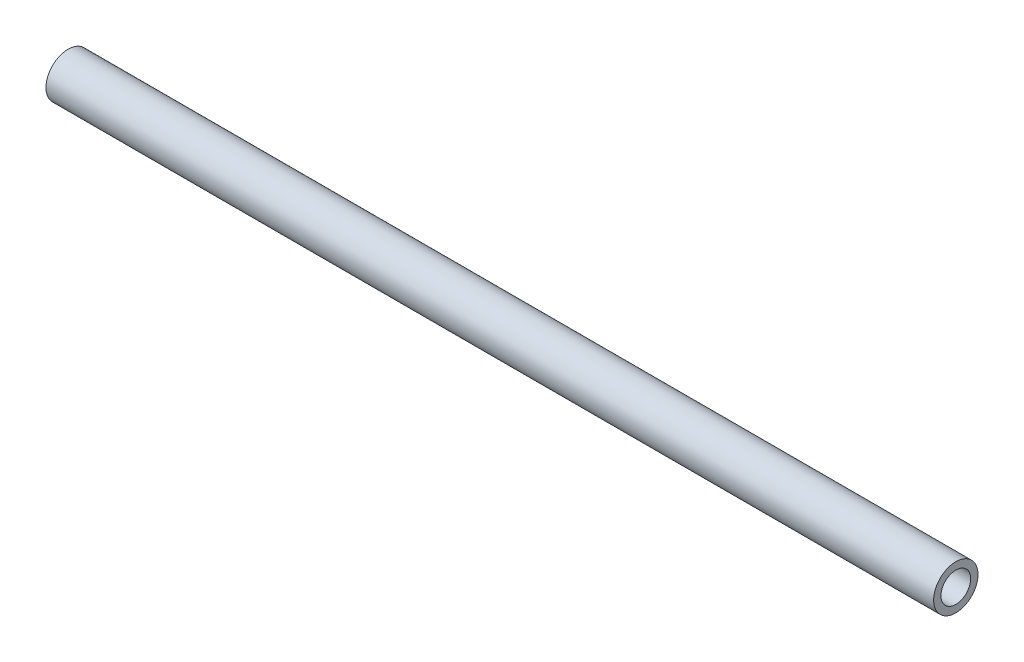
ISO-10303-21;
HEADER;
FILE_DESCRIPTION(('STEP AP214'),'2;1');
FILE_NAME('part.step','',(''),(''),'','','');
FILE_SCHEMA(('AUTOMOTIVE_DESIGN { 1 0 10303 214 1 1 1 1 }'));
ENDSEC;
DATA;
#1=APPLICATION_CONTEXT('core data for automotive mechanical design processes');
#2=APPLICATION_PROTOCOL_DEFINITION('international standard','automotive_design',2000,#1);
#3=PRODUCT_CONTEXT('',#1,'mechanical');
#4=PRODUCT('Part','Part','',(#3));
#5=PRODUCT_RELATED_PRODUCT_CATEGORY('part','',(#4));
#6=PRODUCT_DEFINITION_FORMATION('','',#4);
#7=PRODUCT_DEFINITION_CONTEXT('part definition',#1,'design');
#8=PRODUCT_DEFINITION('design','',#6,#7);
#9=PRODUCT_DEFINITION_SHAPE('','',#8);
#10=(LENGTH_UNIT() NAMED_UNIT(*) SI_UNIT(.MILLI.,.METRE.));
#11=(NAMED_UNIT(*) PLANE_ANGLE_UNIT() SI_UNIT($,.RADIAN.));
#12=(NAMED_UNIT(*) SI_UNIT($,.STERADIAN.) SOLID_ANGLE_UNIT());
#13=UNCERTAINTY_MEASURE_WITH_UNIT(LENGTH_MEASURE(1.E-05),#10,'distance_accuracy_value','');
#14=(GEOMETRIC_REPRESENTATION_CONTEXT(3) GLOBAL_UNCERTAINTY_ASSIGNED_CONTEXT((#13)) GLOBAL_UNIT_ASSIGNED_CONTEXT((#10,
#11,#12)) REPRESENTATION_CONTEXT('',''));
#15=CARTESIAN_POINT('',(0.,0.,0.));
#16=DIRECTION('',(0.,0.,1.));
#17=DIRECTION('',(1.,0.,0.));
#18=AXIS2_PLACEMENT_3D('',#15,#16,#17);
#19=CARTESIAN_POINT('',(127.,0.,0.));
#20=DIRECTION('',(1.,0.,0.));
#21=DIRECTION('',(0.,0.,-1.));
#22=AXIS2_PLACEMENT_3D('',#19,#20,#21);
#23=PLANE('',#22);
#24=CARTESIAN_POINT('',(127.,0.,0.));
#25=DIRECTION('',(1.,0.,0.));
#26=DIRECTION('',(0.,0.,-1.));
#27=AXIS2_PLACEMENT_3D('',#24,#25,#26);
#28=CIRCLE('',#27,3.175);
#29=CARTESIAN_POINT('',(127.,0.,-3.175));
#30=VERTEX_POINT('',#29);
#31=EDGE_CURVE('E10',#30,#30,#28,.T.);
#32=ORIENTED_EDGE('',*,*,#31,.T.);
#33=EDGE_LOOP('',(#32));
#34=FACE_BOUND('',#33,.T.);
#35=CARTESIAN_POINT('',(127.,0.,0.));
#36=DIRECTION('',(1.,0.,0.));
#37=DIRECTION('',(0.,0.,-1.));
#38=AXIS2_PLACEMENT_3D('',#35,#36,#37);
#39=CIRCLE('',#38,2.12725);
#40=CARTESIAN_POINT('',(127.,0.,-2.12725));
#41=VERTEX_POINT('',#40);
#42=EDGE_CURVE('E48',#41,#41,#39,.T.);
#43=ORIENTED_EDGE('',*,*,#42,.F.);
#44=EDGE_LOOP('',(#43));
#45=FACE_BOUND('',#44,.T.);
#46=ADVANCED_FACE('F37',(#34,#45),#23,.T.);
#47=CARTESIAN_POINT('',(0.,0.,0.));
#48=DIRECTION('',(1.,0.,0.));
#49=DIRECTION('',(0.,0.,-1.));
#50=AXIS2_PLACEMENT_3D('',#47,#48,#49);
#51=PLANE('',#50);
#52=CARTESIAN_POINT('',(0.,0.,0.));
#53=DIRECTION('',(1.,0.,0.));
#54=DIRECTION('',(0.,0.,-1.));
#55=AXIS2_PLACEMENT_3D('',#52,#53,#54);
#56=CIRCLE('',#55,3.175);
#57=CARTESIAN_POINT('',(0.,0.,-3.175));
#58=VERTEX_POINT('',#57);
#59=EDGE_CURVE('E41',#58,#58,#56,.T.);
#60=ORIENTED_EDGE('',*,*,#59,.F.);
#61=EDGE_LOOP('',(#60));
#62=FACE_BOUND('',#61,.T.);
#63=CARTESIAN_POINT('',(0.,0.,0.));
#64=DIRECTION('',(1.,0.,0.));
#65=DIRECTION('',(0.,0.,-1.));
#66=AXIS2_PLACEMENT_3D('',#63,#64,#65);
#67=CIRCLE('',#66,2.12725);
#68=CARTESIAN_POINT('',(0.,0.,-2.12725));
#69=VERTEX_POINT('',#68);
#70=EDGE_CURVE('E50',#69,#69,#67,.T.);
#71=ORIENTED_EDGE('',*,*,#70,.T.);
#72=EDGE_LOOP('',(#71));
#73=FACE_BOUND('',#72,.T.);
#74=ADVANCED_FACE('F60',(#62,#73),#51,.F.);
#75=CARTESIAN_POINT('',(127.,0.,0.));
#76=DIRECTION('',(-1.,0.,0.));
#77=DIRECTION('',(0.,0.,1.));
#78=AXIS2_PLACEMENT_3D('',#75,#76,#77);
#79=CYLINDRICAL_SURFACE('',#78,3.175);
#80=ORIENTED_EDGE('',*,*,#31,.F.);
#81=EDGE_LOOP('',(#80));
#82=FACE_BOUND('',#81,.T.);
#83=ORIENTED_EDGE('',*,*,#59,.T.);
#84=EDGE_LOOP('',(#83));
#85=FACE_BOUND('',#84,.T.);
#86=ADVANCED_FACE('F39',(#82,#85),#79,.T.);
#87=CARTESIAN_POINT('',(127.,0.,0.));
#88=DIRECTION('',(-1.,0.,0.));
#89=DIRECTION('',(0.,0.,1.));
#90=AXIS2_PLACEMENT_3D('',#87,#88,#89);
#91=CYLINDRICAL_SURFACE('',#90,2.12725);
#92=ORIENTED_EDGE('',*,*,#42,.T.);
#93=EDGE_LOOP('',(#92));
#94=FACE_BOUND('',#93,.T.);
#95=ORIENTED_EDGE('',*,*,#70,.F.);
#96=EDGE_LOOP('',(#95));
#97=FACE_BOUND('',#96,.T.);
#98=ADVANCED_FACE('F56',(#94,#97),#91,.F.);
#99=CLOSED_SHELL('',(#46,#74,#86,#98));
#100=MANIFOLD_SOLID_BREP('B2',#99);
#101=ADVANCED_BREP_SHAPE_REPRESENTATION('',(#18,#100),#14);
#102=SHAPE_DEFINITION_REPRESENTATION(#9,#101);
ENDSEC;
END-ISO-10303-21;
